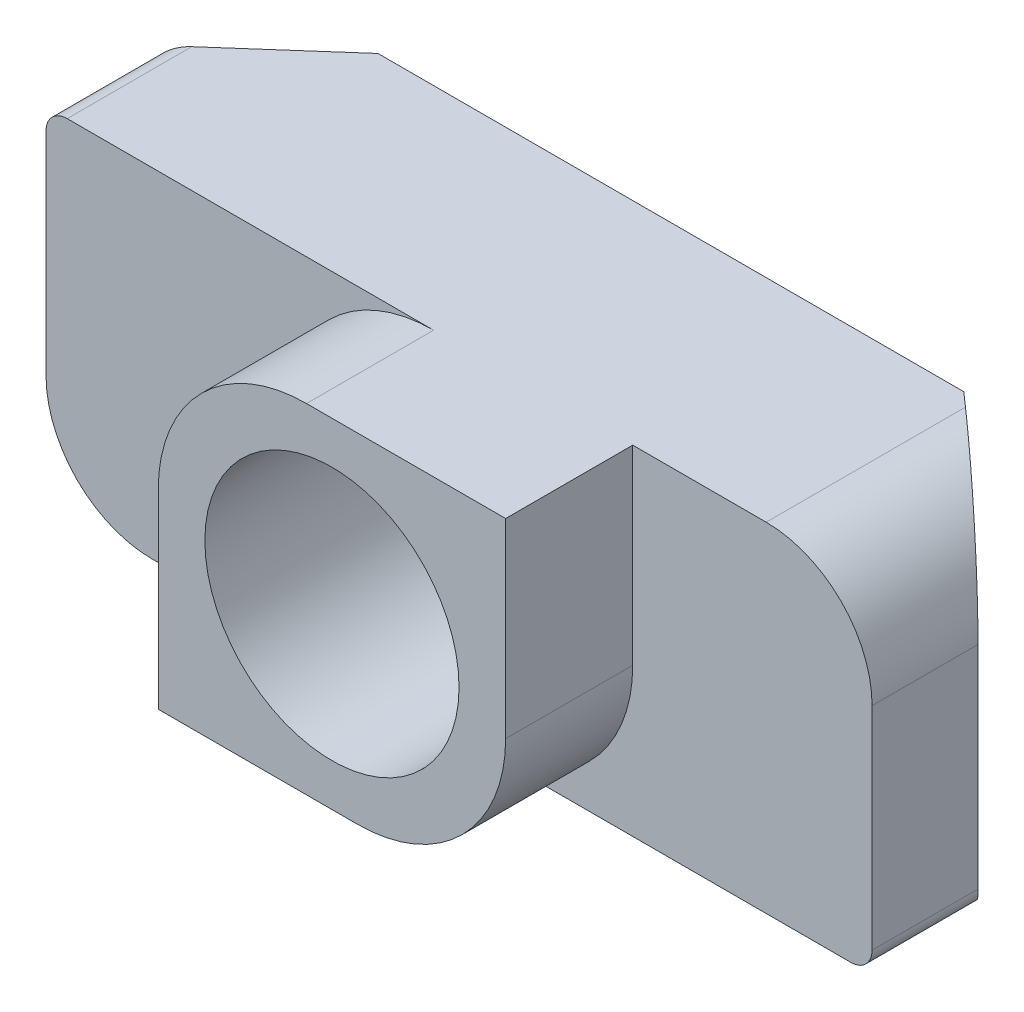
ISO-10303-21;
HEADER;
FILE_DESCRIPTION(('STEP AP214'),'2;1');
FILE_NAME('part.step','',(''),(''),'','','');
FILE_SCHEMA(('AUTOMOTIVE_DESIGN { 1 0 10303 214 1 1 1 1 }'));
ENDSEC;
DATA;
#1=APPLICATION_CONTEXT('core data for automotive mechanical design processes');
#2=APPLICATION_PROTOCOL_DEFINITION('international standard','automotive_design',2000,#1);
#3=PRODUCT_CONTEXT('',#1,'mechanical');
#4=PRODUCT('Part','Part','',(#3));
#5=PRODUCT_RELATED_PRODUCT_CATEGORY('part','',(#4));
#6=PRODUCT_DEFINITION_FORMATION('','',#4);
#7=PRODUCT_DEFINITION_CONTEXT('part definition',#1,'design');
#8=PRODUCT_DEFINITION('design','',#6,#7);
#9=PRODUCT_DEFINITION_SHAPE('','',#8);
#10=(LENGTH_UNIT() NAMED_UNIT(*) SI_UNIT(.MILLI.,.METRE.));
#11=(NAMED_UNIT(*) PLANE_ANGLE_UNIT() SI_UNIT($,.RADIAN.));
#12=(NAMED_UNIT(*) SI_UNIT($,.STERADIAN.) SOLID_ANGLE_UNIT());
#13=UNCERTAINTY_MEASURE_WITH_UNIT(LENGTH_MEASURE(1.E-05),#10,'distance_accuracy_value','');
#14=(GEOMETRIC_REPRESENTATION_CONTEXT(3) GLOBAL_UNCERTAINTY_ASSIGNED_CONTEXT((#13)) GLOBAL_UNIT_ASSIGNED_CONTEXT((#10,
#11,#12)) REPRESENTATION_CONTEXT('',''));
#15=CARTESIAN_POINT('',(0.,0.,0.));
#16=DIRECTION('',(0.,0.,1.));
#17=DIRECTION('',(1.,0.,0.));
#18=AXIS2_PLACEMENT_3D('',#15,#16,#17);
#19=CARTESIAN_POINT('',(9.75000000000001,4.,5.));
#20=DIRECTION('',(0.,0.,-1.));
#21=DIRECTION('',(-1.,0.,0.));
#22=AXIS2_PLACEMENT_3D('',#19,#20,#21);
#23=PLANE('',#22);
#24=DIRECTION('',(0.,1.,0.));
#25=VECTOR('',#24,1.);
#26=CARTESIAN_POINT('',(4.1,-4.,5.));
#27=LINE('',#26,#25);
#28=CARTESIAN_POINT('',(4.1,-0.5,5.));
#29=VERTEX_POINT('',#28);
#30=CARTESIAN_POINT('',(4.1,4.,5.));
#31=VERTEX_POINT('',#30);
#32=EDGE_CURVE('E166',#29,#31,#27,.T.);
#33=ORIENTED_EDGE('',*,*,#32,.F.);
#34=CARTESIAN_POINT('',(0.599999999999999,-0.5,5.));
#35=DIRECTION('',(0.,0.,-1.));
#36=DIRECTION('',(-1.,0.,0.));
#37=AXIS2_PLACEMENT_3D('',#34,#35,#36);
#38=CIRCLE('',#37,3.5);
#39=CARTESIAN_POINT('',(0.599999999999999,-4.,5.));
#40=VERTEX_POINT('',#39);
#41=EDGE_CURVE('E39',#29,#40,#38,.T.);
#42=ORIENTED_EDGE('',*,*,#41,.T.);
#43=DIRECTION('',(1.,0.,0.));
#44=VECTOR('',#43,1.);
#45=CARTESIAN_POINT('',(-9.74999999999999,-4.,5.));
#46=LINE('',#45,#44);
#47=CARTESIAN_POINT('',(9.25000000000001,-4.,5.));
#48=VERTEX_POINT('',#47);
#49=EDGE_CURVE('E202',#40,#48,#46,.T.);
#50=ORIENTED_EDGE('',*,*,#49,.T.);
#51=CARTESIAN_POINT('',(9.25000000000001,-3.5,5.));
#52=DIRECTION('',(0.,0.,-1.));
#53=DIRECTION('',(-1.,0.,0.));
#54=AXIS2_PLACEMENT_3D('',#51,#52,#53);
#55=CIRCLE('',#54,0.5);
#56=CARTESIAN_POINT('',(9.75000000000001,-3.5,5.));
#57=VERTEX_POINT('',#56);
#58=EDGE_CURVE('E260',#48,#57,#55,.F.);
#59=ORIENTED_EDGE('',*,*,#58,.T.);
#60=DIRECTION('',(0.,1.,0.));
#61=VECTOR('',#60,1.);
#62=CARTESIAN_POINT('',(9.75000000000001,-4.,5.));
#63=LINE('',#62,#61);
#64=CARTESIAN_POINT('',(9.75000000000001,1.5,5.));
#65=VERTEX_POINT('',#64);
#66=EDGE_CURVE('E240',#57,#65,#63,.T.);
#67=ORIENTED_EDGE('',*,*,#66,.T.);
#68=CARTESIAN_POINT('',(7.25000000000001,1.5,5.));
#69=DIRECTION('',(0.,0.,-1.));
#70=DIRECTION('',(-1.,0.,0.));
#71=AXIS2_PLACEMENT_3D('',#68,#69,#70);
#72=CIRCLE('',#71,2.5);
#73=CARTESIAN_POINT('',(7.25000000000001,4.,5.));
#74=VERTEX_POINT('',#73);
#75=EDGE_CURVE('E247',#65,#74,#72,.F.);
#76=ORIENTED_EDGE('',*,*,#75,.T.);
#77=DIRECTION('',(-1.,0.,0.));
#78=VECTOR('',#77,1.);
#79=CARTESIAN_POINT('',(-9.74999999999999,4.,5.));
#80=LINE('',#79,#78);
#81=EDGE_CURVE('E283',#74,#31,#80,.T.);
#82=ORIENTED_EDGE('',*,*,#81,.T.);
#83=EDGE_LOOP('',(#33,#42,#50,#59,#67,#76,#82));
#84=FACE_BOUND('',#83,.T.);
#85=ADVANCED_FACE('F31',(#84),#23,.F.);
#86=DIRECTION('',(0.,-1.,0.));
#87=VECTOR('',#86,1.);
#88=CARTESIAN_POINT('',(-4.1,-4.,5.));
#89=LINE('',#88,#87);
#90=CARTESIAN_POINT('',(-4.1,0.5,5.));
#91=VERTEX_POINT('',#90);
#92=CARTESIAN_POINT('',(-4.1,-4.,5.));
#93=VERTEX_POINT('',#92);
#94=EDGE_CURVE('E155',#91,#93,#89,.T.);
#95=ORIENTED_EDGE('',*,*,#94,.F.);
#96=CARTESIAN_POINT('',(-0.599999999999999,0.5,5.));
#97=DIRECTION('',(0.,0.,-1.));
#98=DIRECTION('',(-1.,0.,0.));
#99=AXIS2_PLACEMENT_3D('',#96,#97,#98);
#100=CIRCLE('',#99,3.5);
#101=CARTESIAN_POINT('',(-0.599999999999999,4.,5.));
#102=VERTEX_POINT('',#101);
#103=EDGE_CURVE('E11',#91,#102,#100,.T.);
#104=ORIENTED_EDGE('',*,*,#103,.T.);
#105=CARTESIAN_POINT('',(-9.24999999999999,4.,5.));
#106=VERTEX_POINT('',#105);
#107=EDGE_CURVE('E46',#102,#106,#80,.T.);
#108=ORIENTED_EDGE('',*,*,#107,.T.);
#109=CARTESIAN_POINT('',(-9.24999999999999,3.5,5.));
#110=DIRECTION('',(0.,0.,-1.));
#111=DIRECTION('',(-1.,0.,0.));
#112=AXIS2_PLACEMENT_3D('',#109,#110,#111);
#113=CIRCLE('',#112,0.5);
#114=CARTESIAN_POINT('',(-9.74999999999999,3.5,5.));
#115=VERTEX_POINT('',#114);
#116=EDGE_CURVE('E258',#106,#115,#113,.F.);
#117=ORIENTED_EDGE('',*,*,#116,.T.);
#118=DIRECTION('',(0.,-1.,0.));
#119=VECTOR('',#118,1.);
#120=CARTESIAN_POINT('',(-9.74999999999999,-4.,5.));
#121=LINE('',#120,#119);
#122=CARTESIAN_POINT('',(-9.74999999999999,-1.5,5.));
#123=VERTEX_POINT('',#122);
#124=EDGE_CURVE('E231',#115,#123,#121,.T.);
#125=ORIENTED_EDGE('',*,*,#124,.T.);
#126=CARTESIAN_POINT('',(-7.24999999999999,-1.5,5.));
#127=DIRECTION('',(0.,0.,-1.));
#128=DIRECTION('',(-1.,0.,0.));
#129=AXIS2_PLACEMENT_3D('',#126,#127,#128);
#130=CIRCLE('',#129,2.5);
#131=CARTESIAN_POINT('',(-7.24999999999999,-4.,5.));
#132=VERTEX_POINT('',#131);
#133=EDGE_CURVE('E245',#123,#132,#130,.F.);
#134=ORIENTED_EDGE('',*,*,#133,.T.);
#135=EDGE_CURVE('E222',#132,#93,#46,.T.);
#136=ORIENTED_EDGE('',*,*,#135,.T.);
#137=EDGE_LOOP('',(#95,#104,#108,#117,#125,#134,#136));
#138=FACE_BOUND('',#137,.T.);
#139=ADVANCED_FACE('F277',(#138),#23,.F.);
#140=CARTESIAN_POINT('',(9.75000000000001,-4.,5.));
#141=DIRECTION('',(-1.,0.,0.));
#142=DIRECTION('',(0.,0.,1.));
#143=AXIS2_PLACEMENT_3D('',#140,#141,#142);
#144=PLANE('',#143);
#145=DIRECTION('',(0.,-1.,0.));
#146=VECTOR('',#145,1.);
#147=CARTESIAN_POINT('',(9.74999999999999,4.,2.5));
#148=LINE('',#147,#146);
#149=CARTESIAN_POINT('',(9.75000000000001,1.5,2.50000000000001));
#150=VERTEX_POINT('',#149);
#151=CARTESIAN_POINT('',(9.75000000000001,-3.5,2.50000000000001));
#152=VERTEX_POINT('',#151);
#153=EDGE_CURVE('E302',#150,#152,#148,.T.);
#154=ORIENTED_EDGE('',*,*,#153,.F.);
#155=DIRECTION('',(0.,0.,-1.));
#156=VECTOR('',#155,1.);
#157=CARTESIAN_POINT('',(9.75000000000001,1.5,5.));
#158=LINE('',#157,#156);
#159=EDGE_CURVE('E243',#150,#65,#158,.F.);
#160=ORIENTED_EDGE('',*,*,#159,.T.);
#161=ORIENTED_EDGE('',*,*,#66,.F.);
#162=DIRECTION('',(0.,0.,-1.));
#163=VECTOR('',#162,1.);
#164=CARTESIAN_POINT('',(9.75000000000001,-3.5,5.));
#165=LINE('',#164,#163);
#166=EDGE_CURVE('E254',#57,#152,#165,.T.);
#167=ORIENTED_EDGE('',*,*,#166,.T.);
#168=EDGE_LOOP('',(#154,#160,#161,#167));
#169=FACE_BOUND('',#168,.T.);
#170=ADVANCED_FACE('F351',(#169),#144,.F.);
#171=CARTESIAN_POINT('',(-9.74999999999999,4.,5.));
#172=DIRECTION('',(0.,-1.,0.));
#173=DIRECTION('',(0.,0.,-1.));
#174=AXIS2_PLACEMENT_3D('',#171,#172,#173);
#175=PLANE('',#174);
#176=ORIENTED_EDGE('',*,*,#107,.F.);
#177=DIRECTION('',(0.,0.,-1.));
#178=VECTOR('',#177,1.);
#179=CARTESIAN_POINT('',(-0.6,4.,5.));
#180=LINE('',#179,#178);
#181=CARTESIAN_POINT('',(-0.599999999999999,4.,8.));
#182=VERTEX_POINT('',#181);
#183=EDGE_CURVE('E161',#102,#182,#180,.F.);
#184=ORIENTED_EDGE('',*,*,#183,.T.);
#185=DIRECTION('',(-1.,0.,0.));
#186=VECTOR('',#185,1.);
#187=CARTESIAN_POINT('',(-4.1,4.,8.));
#188=LINE('',#187,#186);
#189=CARTESIAN_POINT('',(4.1,4.,8.));
#190=VERTEX_POINT('',#189);
#191=EDGE_CURVE('E147',#190,#182,#188,.T.);
#192=ORIENTED_EDGE('',*,*,#191,.F.);
#193=DIRECTION('',(0.,0.,-1.));
#194=VECTOR('',#193,1.);
#195=CARTESIAN_POINT('',(4.1,4.,8.));
#196=LINE('',#195,#194);
#197=EDGE_CURVE('E160',#190,#31,#196,.T.);
#198=ORIENTED_EDGE('',*,*,#197,.T.);
#199=ORIENTED_EDGE('',*,*,#81,.F.);
#200=DIRECTION('',(0.,0.,-1.));
#201=VECTOR('',#200,1.);
#202=CARTESIAN_POINT('',(7.25000000000001,4.,5.));
#203=LINE('',#202,#201);
#204=CARTESIAN_POINT('',(7.25000000000001,4.,0.296102160868359));
#205=VERTEX_POINT('',#204);
#206=EDGE_CURVE('E226',#74,#205,#203,.T.);
#207=ORIENTED_EDGE('',*,*,#206,.T.);
#208=DIRECTION('',(0.750133193592808,0.,0.661286769768045));
#209=VECTOR('',#208,1.);
#210=CARTESIAN_POINT('',(9.74999999999999,4.,2.5));
#211=LINE('',#210,#209);
#212=CARTESIAN_POINT('',(6.91411537366789,4.,0.));
#213=VERTEX_POINT('',#212);
#214=EDGE_CURVE('E172',#213,#205,#211,.T.);
#215=ORIENTED_EDGE('',*,*,#214,.F.);
#216=DIRECTION('',(-1.,0.,0.));
#217=VECTOR('',#216,1.);
#218=CARTESIAN_POINT('',(-9.74999999999999,4.,0.));
#219=LINE('',#218,#217);
#220=CARTESIAN_POINT('',(-6.91411537366789,4.,0.));
#221=VERTEX_POINT('',#220);
#222=EDGE_CURVE('E233',#213,#221,#219,.T.);
#223=ORIENTED_EDGE('',*,*,#222,.T.);
#224=DIRECTION('',(-0.750133193592808,0.,0.661286769768045));
#225=VECTOR('',#224,1.);
#226=CARTESIAN_POINT('',(-9.74999999999999,4.,2.5));
#227=LINE('',#226,#225);
#228=CARTESIAN_POINT('',(-9.24999999999999,4.,2.05922043217367));
#229=VERTEX_POINT('',#228);
#230=EDGE_CURVE('E268',#221,#229,#227,.T.);
#231=ORIENTED_EDGE('',*,*,#230,.T.);
#232=DIRECTION('',(0.,0.,-1.));
#233=VECTOR('',#232,1.);
#234=CARTESIAN_POINT('',(-9.24999999999999,4.,5.));
#235=LINE('',#234,#233);
#236=EDGE_CURVE('E218',#229,#106,#235,.F.);
#237=ORIENTED_EDGE('',*,*,#236,.T.);
#238=EDGE_LOOP('',(#176,#184,#192,#198,#199,#207,#215,#223,#231,#237));
#239=FACE_BOUND('',#238,.T.);
#240=ADVANCED_FACE('F158',(#239),#175,.F.);
#241=CARTESIAN_POINT('',(-9.74999999999999,-4.,5.));
#242=DIRECTION('',(0.,1.,0.));
#243=DIRECTION('',(0.,0.,1.));
#244=AXIS2_PLACEMENT_3D('',#241,#242,#243);
#245=PLANE('',#244);
#246=ORIENTED_EDGE('',*,*,#49,.F.);
#247=DIRECTION('',(0.,0.,-1.));
#248=VECTOR('',#247,1.);
#249=CARTESIAN_POINT('',(0.6,-4.,5.));
#250=LINE('',#249,#248);
#251=CARTESIAN_POINT('',(0.6,-4.,8.));
#252=VERTEX_POINT('',#251);
#253=EDGE_CURVE('E205',#40,#252,#250,.F.);
#254=ORIENTED_EDGE('',*,*,#253,.T.);
#255=DIRECTION('',(1.,0.,0.));
#256=VECTOR('',#255,1.);
#257=CARTESIAN_POINT('',(-4.1,-4.,8.));
#258=LINE('',#257,#256);
#259=CARTESIAN_POINT('',(-4.1,-4.,8.));
#260=VERTEX_POINT('',#259);
#261=EDGE_CURVE('E175',#260,#252,#258,.T.);
#262=ORIENTED_EDGE('',*,*,#261,.F.);
#263=DIRECTION('',(0.,0.,-1.));
#264=VECTOR('',#263,1.);
#265=CARTESIAN_POINT('',(-4.1,-4.,8.));
#266=LINE('',#265,#264);
#267=EDGE_CURVE('E169',#260,#93,#266,.T.);
#268=ORIENTED_EDGE('',*,*,#267,.T.);
#269=ORIENTED_EDGE('',*,*,#135,.F.);
#270=DIRECTION('',(0.,0.,-1.));
#271=VECTOR('',#270,1.);
#272=CARTESIAN_POINT('',(-7.24999999999999,-4.,5.));
#273=LINE('',#272,#271);
#274=CARTESIAN_POINT('',(-7.24999999999999,-4.,0.296102160868349));
#275=VERTEX_POINT('',#274);
#276=EDGE_CURVE('E249',#132,#275,#273,.T.);
#277=ORIENTED_EDGE('',*,*,#276,.T.);
#278=DIRECTION('',(-0.750133193592808,0.,0.661286769768045));
#279=VECTOR('',#278,1.);
#280=CARTESIAN_POINT('',(-9.74999999999999,-4.,2.5));
#281=LINE('',#280,#279);
#282=CARTESIAN_POINT('',(-6.91411537366789,-4.,0.));
#283=VERTEX_POINT('',#282);
#284=EDGE_CURVE('E295',#283,#275,#281,.T.);
#285=ORIENTED_EDGE('',*,*,#284,.F.);
#286=DIRECTION('',(1.,0.,0.));
#287=VECTOR('',#286,1.);
#288=CARTESIAN_POINT('',(-9.74999999999999,-4.,0.));
#289=LINE('',#288,#287);
#290=CARTESIAN_POINT('',(6.91411537366789,-4.,0.));
#291=VERTEX_POINT('',#290);
#292=EDGE_CURVE('E236',#283,#291,#289,.T.);
#293=ORIENTED_EDGE('',*,*,#292,.T.);
#294=DIRECTION('',(0.750133193592808,0.,0.661286769768045));
#295=VECTOR('',#294,1.);
#296=CARTESIAN_POINT('',(9.74999999999999,-4.,2.5));
#297=LINE('',#296,#295);
#298=CARTESIAN_POINT('',(9.25000000000001,-4.,2.05922043217368));
#299=VERTEX_POINT('',#298);
#300=EDGE_CURVE('E168',#291,#299,#297,.T.);
#301=ORIENTED_EDGE('',*,*,#300,.T.);
#302=DIRECTION('',(0.,0.,-1.));
#303=VECTOR('',#302,1.);
#304=CARTESIAN_POINT('',(9.25000000000001,-4.,5.));
#305=LINE('',#304,#303);
#306=EDGE_CURVE('E256',#299,#48,#305,.F.);
#307=ORIENTED_EDGE('',*,*,#306,.T.);
#308=EDGE_LOOP('',(#246,#254,#262,#268,#269,#277,#285,#293,#301,#307));
#309=FACE_BOUND('',#308,.T.);
#310=ADVANCED_FACE('F313',(#309),#245,.F.);
#311=CARTESIAN_POINT('',(9.75000000000001,4.,0.));
#312=DIRECTION('',(0.,0.,-1.));
#313=DIRECTION('',(-1.,0.,0.));
#314=AXIS2_PLACEMENT_3D('',#311,#312,#313);
#315=PLANE('',#314);
#316=CARTESIAN_POINT('',(0.,0.,0.));
#317=DIRECTION('',(0.,0.,1.));
#318=DIRECTION('',(1.,0.,0.));
#319=AXIS2_PLACEMENT_3D('',#316,#317,#318);
#320=CIRCLE('',#319,3.);
#321=CARTESIAN_POINT('',(3.,0.,0.));
#322=VERTEX_POINT('',#321);
#323=EDGE_CURVE('E184',#322,#322,#320,.T.);
#324=ORIENTED_EDGE('',*,*,#323,.T.);
#325=EDGE_LOOP('',(#324));
#326=FACE_BOUND('',#325,.T.);
#327=ORIENTED_EDGE('',*,*,#222,.F.);
#328=DIRECTION('',(0.,-1.,0.));
#329=VECTOR('',#328,1.);
#330=CARTESIAN_POINT('',(6.91411537366789,4.,0.));
#331=LINE('',#330,#329);
#332=EDGE_CURVE('E301',#213,#291,#331,.T.);
#333=ORIENTED_EDGE('',*,*,#332,.T.);
#334=ORIENTED_EDGE('',*,*,#292,.F.);
#335=DIRECTION('',(0.,-1.,0.));
#336=VECTOR('',#335,1.);
#337=CARTESIAN_POINT('',(-6.91411537366789,4.,0.));
#338=LINE('',#337,#336);
#339=EDGE_CURVE('E292',#221,#283,#338,.T.);
#340=ORIENTED_EDGE('',*,*,#339,.F.);
#341=EDGE_LOOP('',(#327,#333,#334,#340));
#342=FACE_BOUND('',#341,.T.);
#343=ADVANCED_FACE('F308',(#326,#342),#315,.T.);
#344=CARTESIAN_POINT('',(7.25000000000001,1.5,5.));
#345=DIRECTION('',(0.,0.,-1.));
#346=DIRECTION('',(-1.,0.,0.));
#347=AXIS2_PLACEMENT_3D('',#344,#345,#346);
#348=CYLINDRICAL_SURFACE('',#347,2.5);
#349=ORIENTED_EDGE('',*,*,#159,.F.);
#350=CARTESIAN_POINT('',(7.25000000000001,1.5,0.296102160868359));
#351=DIRECTION('',(0.661286769768045,0.,-0.750133193592808));
#352=DIRECTION('',(-0.750133193592808,0.,-0.661286769768045));
#353=AXIS2_PLACEMENT_3D('',#350,#351,#352);
#354=ELLIPSE('',#353,3.33274146692016,2.5);
#355=EDGE_CURVE('E297',#150,#205,#354,.F.);
#356=ORIENTED_EDGE('',*,*,#355,.T.);
#357=ORIENTED_EDGE('',*,*,#206,.F.);
#358=ORIENTED_EDGE('',*,*,#75,.F.);
#359=EDGE_LOOP('',(#349,#356,#357,#358));
#360=FACE_BOUND('',#359,.T.);
#361=ADVANCED_FACE('F357',(#360),#348,.T.);
#362=CARTESIAN_POINT('',(9.25000000000001,-3.5,5.));
#363=DIRECTION('',(0.,0.,-1.));
#364=DIRECTION('',(-1.,0.,0.));
#365=AXIS2_PLACEMENT_3D('',#362,#363,#364);
#366=CYLINDRICAL_SURFACE('',#365,0.5);
#367=ORIENTED_EDGE('',*,*,#306,.F.);
#368=CARTESIAN_POINT('',(9.25000000000001,-3.5,2.05922043217368));
#369=DIRECTION('',(0.661286769768045,0.,-0.750133193592808));
#370=DIRECTION('',(-0.750133193592808,0.,-0.661286769768045));
#371=AXIS2_PLACEMENT_3D('',#368,#369,#370);
#372=ELLIPSE('',#371,0.666548293384033,0.5);
#373=EDGE_CURVE('E210',#299,#152,#372,.F.);
#374=ORIENTED_EDGE('',*,*,#373,.T.);
#375=ORIENTED_EDGE('',*,*,#166,.F.);
#376=ORIENTED_EDGE('',*,*,#58,.F.);
#377=EDGE_LOOP('',(#367,#374,#375,#376));
#378=FACE_BOUND('',#377,.T.);
#379=ADVANCED_FACE('F362',(#378),#366,.T.);
#380=CARTESIAN_POINT('',(-9.74999999999999,-4.,5.));
#381=DIRECTION('',(1.,0.,0.));
#382=DIRECTION('',(0.,0.,-1.));
#383=AXIS2_PLACEMENT_3D('',#380,#381,#382);
#384=PLANE('',#383);
#385=DIRECTION('',(0.,0.,-1.));
#386=VECTOR('',#385,1.);
#387=CARTESIAN_POINT('',(-9.74999999999999,3.5,5.));
#388=LINE('',#387,#386);
#389=CARTESIAN_POINT('',(-9.74999999999999,3.5,2.5));
#390=VERTEX_POINT('',#389);
#391=EDGE_CURVE('E262',#115,#390,#388,.T.);
#392=ORIENTED_EDGE('',*,*,#391,.T.);
#393=DIRECTION('',(0.,-1.,0.));
#394=VECTOR('',#393,1.);
#395=CARTESIAN_POINT('',(-9.74999999999999,4.,2.5));
#396=LINE('',#395,#394);
#397=CARTESIAN_POINT('',(-9.74999999999999,-1.5,2.5));
#398=VERTEX_POINT('',#397);
#399=EDGE_CURVE('E291',#390,#398,#396,.T.);
#400=ORIENTED_EDGE('',*,*,#399,.T.);
#401=DIRECTION('',(0.,0.,-1.));
#402=VECTOR('',#401,1.);
#403=CARTESIAN_POINT('',(-9.74999999999999,-1.5,5.));
#404=LINE('',#403,#402);
#405=EDGE_CURVE('E252',#398,#123,#404,.F.);
#406=ORIENTED_EDGE('',*,*,#405,.T.);
#407=ORIENTED_EDGE('',*,*,#124,.F.);
#408=EDGE_LOOP('',(#392,#400,#406,#407));
#409=FACE_BOUND('',#408,.T.);
#410=ADVANCED_FACE('F280',(#409),#384,.F.);
#411=CARTESIAN_POINT('',(-7.24999999999999,-1.5,5.));
#412=DIRECTION('',(0.,0.,-1.));
#413=DIRECTION('',(-1.,0.,0.));
#414=AXIS2_PLACEMENT_3D('',#411,#412,#413);
#415=CYLINDRICAL_SURFACE('',#414,2.5);
#416=CARTESIAN_POINT('',(-7.24999999999999,-1.5,0.296102160868349));
#417=DIRECTION('',(0.661286769768045,0.,0.750133193592808));
#418=DIRECTION('',(0.750133193592808,0.,-0.661286769768045));
#419=AXIS2_PLACEMENT_3D('',#416,#417,#418);
#420=ELLIPSE('',#419,3.33274146692016,2.5);
#421=EDGE_CURVE('E237',#275,#398,#420,.F.);
#422=ORIENTED_EDGE('',*,*,#421,.F.);
#423=ORIENTED_EDGE('',*,*,#276,.F.);
#424=ORIENTED_EDGE('',*,*,#133,.F.);
#425=ORIENTED_EDGE('',*,*,#405,.F.);
#426=EDGE_LOOP('',(#422,#423,#424,#425));
#427=FACE_BOUND('',#426,.T.);
#428=ADVANCED_FACE('F320',(#427),#415,.T.);
#429=CARTESIAN_POINT('',(-9.24999999999999,3.5,5.));
#430=DIRECTION('',(0.,0.,-1.));
#431=DIRECTION('',(-1.,0.,0.));
#432=AXIS2_PLACEMENT_3D('',#429,#430,#431);
#433=CYLINDRICAL_SURFACE('',#432,0.5);
#434=CARTESIAN_POINT('',(-9.24999999999999,3.5,2.05922043217367));
#435=DIRECTION('',(0.661286769768045,0.,0.750133193592808));
#436=DIRECTION('',(0.750133193592808,0.,-0.661286769768045));
#437=AXIS2_PLACEMENT_3D('',#434,#435,#436);
#438=ELLIPSE('',#437,0.666548293384033,0.5);
#439=EDGE_CURVE('E212',#390,#229,#438,.F.);
#440=ORIENTED_EDGE('',*,*,#439,.F.);
#441=ORIENTED_EDGE('',*,*,#391,.F.);
#442=ORIENTED_EDGE('',*,*,#116,.F.);
#443=ORIENTED_EDGE('',*,*,#236,.F.);
#444=EDGE_LOOP('',(#440,#441,#442,#443));
#445=FACE_BOUND('',#444,.T.);
#446=ADVANCED_FACE('F272',(#445),#433,.T.);
#447=CARTESIAN_POINT('',(-9.74999999999999,4.,2.5));
#448=DIRECTION('',(0.661286769768045,0.,0.750133193592808));
#449=DIRECTION('',(0.750133193592808,0.,-0.661286769768045));
#450=AXIS2_PLACEMENT_3D('',#447,#448,#449);
#451=PLANE('',#450);
#452=ORIENTED_EDGE('',*,*,#421,.T.);
#453=ORIENTED_EDGE('',*,*,#399,.F.);
#454=ORIENTED_EDGE('',*,*,#439,.T.);
#455=ORIENTED_EDGE('',*,*,#230,.F.);
#456=ORIENTED_EDGE('',*,*,#339,.T.);
#457=ORIENTED_EDGE('',*,*,#284,.T.);
#458=EDGE_LOOP('',(#452,#453,#454,#455,#456,#457));
#459=FACE_BOUND('',#458,.T.);
#460=ADVANCED_FACE('F318',(#459),#451,.F.);
#461=CARTESIAN_POINT('',(9.74999999999999,4.,2.5));
#462=DIRECTION('',(0.661286769768045,0.,-0.750133193592808));
#463=DIRECTION('',(-0.750133193592808,0.,-0.661286769768045));
#464=AXIS2_PLACEMENT_3D('',#461,#462,#463);
#465=PLANE('',#464);
#466=ORIENTED_EDGE('',*,*,#153,.T.);
#467=ORIENTED_EDGE('',*,*,#373,.F.);
#468=ORIENTED_EDGE('',*,*,#300,.F.);
#469=ORIENTED_EDGE('',*,*,#332,.F.);
#470=ORIENTED_EDGE('',*,*,#214,.T.);
#471=ORIENTED_EDGE('',*,*,#355,.F.);
#472=EDGE_LOOP('',(#466,#467,#468,#469,#470,#471));
#473=FACE_BOUND('',#472,.T.);
#474=ADVANCED_FACE('F379',(#473),#465,.T.);
#475=CARTESIAN_POINT('',(4.1,-4.,8.));
#476=DIRECTION('',(-1.,0.,0.));
#477=DIRECTION('',(0.,0.,1.));
#478=AXIS2_PLACEMENT_3D('',#475,#476,#477);
#479=PLANE('',#478);
#480=DIRECTION('',(0.,1.,0.));
#481=VECTOR('',#480,1.);
#482=CARTESIAN_POINT('',(4.1,-4.,8.));
#483=LINE('',#482,#481);
#484=CARTESIAN_POINT('',(4.1,-0.5,8.));
#485=VERTEX_POINT('',#484);
#486=EDGE_CURVE('E143',#485,#190,#483,.T.);
#487=ORIENTED_EDGE('',*,*,#486,.F.);
#488=DIRECTION('',(0.,0.,-1.));
#489=VECTOR('',#488,1.);
#490=CARTESIAN_POINT('',(4.1,-0.5,8.));
#491=LINE('',#490,#489);
#492=EDGE_CURVE('E185',#485,#29,#491,.T.);
#493=ORIENTED_EDGE('',*,*,#492,.T.);
#494=ORIENTED_EDGE('',*,*,#32,.T.);
#495=ORIENTED_EDGE('',*,*,#197,.F.);
#496=EDGE_LOOP('',(#487,#493,#494,#495));
#497=FACE_BOUND('',#496,.T.);
#498=ADVANCED_FACE('F164',(#497),#479,.F.);
#499=CARTESIAN_POINT('',(-4.1,-4.,8.));
#500=DIRECTION('',(1.,0.,0.));
#501=DIRECTION('',(0.,0.,-1.));
#502=AXIS2_PLACEMENT_3D('',#499,#500,#501);
#503=PLANE('',#502);
#504=DIRECTION('',(0.,-1.,0.));
#505=VECTOR('',#504,1.);
#506=CARTESIAN_POINT('',(-4.1,-4.,8.));
#507=LINE('',#506,#505);
#508=CARTESIAN_POINT('',(-4.1,0.5,8.));
#509=VERTEX_POINT('',#508);
#510=EDGE_CURVE('E162',#509,#260,#507,.T.);
#511=ORIENTED_EDGE('',*,*,#510,.F.);
#512=DIRECTION('',(0.,0.,-1.));
#513=VECTOR('',#512,1.);
#514=CARTESIAN_POINT('',(-4.1,0.5,8.));
#515=LINE('',#514,#513);
#516=EDGE_CURVE('E197',#509,#91,#515,.T.);
#517=ORIENTED_EDGE('',*,*,#516,.T.);
#518=ORIENTED_EDGE('',*,*,#94,.T.);
#519=ORIENTED_EDGE('',*,*,#267,.F.);
#520=EDGE_LOOP('',(#511,#517,#518,#519));
#521=FACE_BOUND('',#520,.T.);
#522=ADVANCED_FACE('F324',(#521),#503,.F.);
#523=CARTESIAN_POINT('',(4.1,4.,8.));
#524=DIRECTION('',(0.,0.,-1.));
#525=DIRECTION('',(-1.,0.,0.));
#526=AXIS2_PLACEMENT_3D('',#523,#524,#525);
#527=PLANE('',#526);
#528=CARTESIAN_POINT('',(0.,0.,8.));
#529=DIRECTION('',(0.,0.,1.));
#530=DIRECTION('',(1.,0.,0.));
#531=AXIS2_PLACEMENT_3D('',#528,#529,#530);
#532=CIRCLE('',#531,3.);
#533=CARTESIAN_POINT('',(3.,0.,8.));
#534=VERTEX_POINT('',#533);
#535=EDGE_CURVE('E326',#534,#534,#532,.T.);
#536=ORIENTED_EDGE('',*,*,#535,.F.);
#537=EDGE_LOOP('',(#536));
#538=FACE_BOUND('',#537,.T.);
#539=ORIENTED_EDGE('',*,*,#261,.T.);
#540=CARTESIAN_POINT('',(0.599999999999999,-0.5,8.));
#541=DIRECTION('',(0.,0.,-1.));
#542=DIRECTION('',(-1.,0.,0.));
#543=AXIS2_PLACEMENT_3D('',#540,#541,#542);
#544=CIRCLE('',#543,3.5);
#545=EDGE_CURVE('E150',#252,#485,#544,.F.);
#546=ORIENTED_EDGE('',*,*,#545,.T.);
#547=ORIENTED_EDGE('',*,*,#486,.T.);
#548=ORIENTED_EDGE('',*,*,#191,.T.);
#549=CARTESIAN_POINT('',(-0.599999999999999,0.5,8.));
#550=DIRECTION('',(0.,0.,-1.));
#551=DIRECTION('',(-1.,0.,0.));
#552=AXIS2_PLACEMENT_3D('',#549,#550,#551);
#553=CIRCLE('',#552,3.5);
#554=EDGE_CURVE('E209',#182,#509,#553,.F.);
#555=ORIENTED_EDGE('',*,*,#554,.T.);
#556=ORIENTED_EDGE('',*,*,#510,.T.);
#557=EDGE_LOOP('',(#539,#546,#547,#548,#555,#556));
#558=FACE_BOUND('',#557,.T.);
#559=ADVANCED_FACE('F146',(#538,#558),#527,.F.);
#560=CARTESIAN_POINT('',(0.599999999999999,-0.5,8.));
#561=DIRECTION('',(0.,0.,-1.));
#562=DIRECTION('',(-1.,0.,0.));
#563=AXIS2_PLACEMENT_3D('',#560,#561,#562);
#564=CYLINDRICAL_SURFACE('',#563,3.5);
#565=ORIENTED_EDGE('',*,*,#545,.F.);
#566=ORIENTED_EDGE('',*,*,#253,.F.);
#567=ORIENTED_EDGE('',*,*,#41,.F.);
#568=ORIENTED_EDGE('',*,*,#492,.F.);
#569=EDGE_LOOP('',(#565,#566,#567,#568));
#570=FACE_BOUND('',#569,.T.);
#571=ADVANCED_FACE('F206',(#570),#564,.T.);
#572=CARTESIAN_POINT('',(-0.599999999999999,0.5,8.));
#573=DIRECTION('',(0.,0.,-1.));
#574=DIRECTION('',(-1.,0.,0.));
#575=AXIS2_PLACEMENT_3D('',#572,#573,#574);
#576=CYLINDRICAL_SURFACE('',#575,3.5);
#577=ORIENTED_EDGE('',*,*,#554,.F.);
#578=ORIENTED_EDGE('',*,*,#183,.F.);
#579=ORIENTED_EDGE('',*,*,#103,.F.);
#580=ORIENTED_EDGE('',*,*,#516,.F.);
#581=EDGE_LOOP('',(#577,#578,#579,#580));
#582=FACE_BOUND('',#581,.T.);
#583=ADVANCED_FACE('F33',(#582),#576,.T.);
#584=CARTESIAN_POINT('',(0.,0.,0.));
#585=DIRECTION('',(0.,0.,1.));
#586=DIRECTION('',(1.,0.,0.));
#587=AXIS2_PLACEMENT_3D('',#584,#585,#586);
#588=CYLINDRICAL_SURFACE('',#587,3.);
#589=ORIENTED_EDGE('',*,*,#323,.F.);
#590=EDGE_LOOP('',(#589));
#591=FACE_BOUND('',#590,.T.);
#592=ORIENTED_EDGE('',*,*,#535,.T.);
#593=EDGE_LOOP('',(#592));
#594=FACE_BOUND('',#593,.T.);
#595=ADVANCED_FACE('F333',(#591,#594),#588,.F.);
#596=CLOSED_SHELL('',(#85,#139,#170,#240,#310,#343,#361,#379,#410,#428,#446,#460,#474,#498,#522,
#559,#571,#583,#595));
#597=MANIFOLD_SOLID_BREP('B2',#596);
#598=ADVANCED_BREP_SHAPE_REPRESENTATION('',(#18,#597),#14);
#599=SHAPE_DEFINITION_REPRESENTATION(#9,#598);
ENDSEC;
END-ISO-10303-21;
